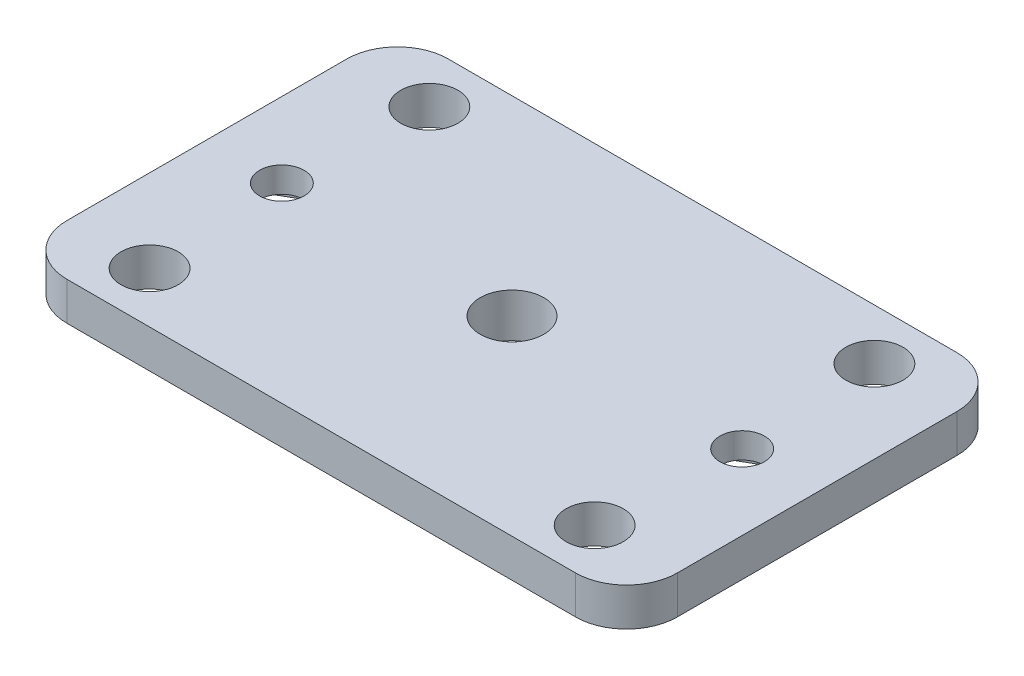
ISO-10303-21;
HEADER;
FILE_DESCRIPTION(('STEP AP214'),'2;1');
FILE_NAME('part.step','',(''),(''),'','','');
FILE_SCHEMA(('AUTOMOTIVE_DESIGN { 1 0 10303 214 1 1 1 1 }'));
ENDSEC;
DATA;
#1=APPLICATION_CONTEXT('core data for automotive mechanical design processes');
#2=APPLICATION_PROTOCOL_DEFINITION('international standard','automotive_design',2000,#1);
#3=PRODUCT_CONTEXT('',#1,'mechanical');
#4=PRODUCT('Part','Part','',(#3));
#5=PRODUCT_RELATED_PRODUCT_CATEGORY('part','',(#4));
#6=PRODUCT_DEFINITION_FORMATION('','',#4);
#7=PRODUCT_DEFINITION_CONTEXT('part definition',#1,'design');
#8=PRODUCT_DEFINITION('design','',#6,#7);
#9=PRODUCT_DEFINITION_SHAPE('','',#8);
#10=(LENGTH_UNIT() NAMED_UNIT(*) SI_UNIT(.MILLI.,.METRE.));
#11=(NAMED_UNIT(*) PLANE_ANGLE_UNIT() SI_UNIT($,.RADIAN.));
#12=(NAMED_UNIT(*) SI_UNIT($,.STERADIAN.) SOLID_ANGLE_UNIT());
#13=UNCERTAINTY_MEASURE_WITH_UNIT(LENGTH_MEASURE(1.E-05),#10,'distance_accuracy_value','');
#14=(GEOMETRIC_REPRESENTATION_CONTEXT(3) GLOBAL_UNCERTAINTY_ASSIGNED_CONTEXT((#13)) GLOBAL_UNIT_ASSIGNED_CONTEXT((#10,
#11,#12)) REPRESENTATION_CONTEXT('',''));
#15=CARTESIAN_POINT('',(0.,0.,0.));
#16=DIRECTION('',(0.,0.,1.));
#17=DIRECTION('',(1.,0.,0.));
#18=AXIS2_PLACEMENT_3D('',#15,#16,#17);
#19=CARTESIAN_POINT('',(0.,-0.45,0.));
#20=DIRECTION('',(0.,1.,0.));
#21=DIRECTION('',(0.,0.,1.));
#22=AXIS2_PLACEMENT_3D('',#19,#20,#21);
#23=CYLINDRICAL_SURFACE('',#22,3.50226733403824);
#24=CARTESIAN_POINT('',(0.,-0.45,0.));
#25=DIRECTION('',(0.,-1.,0.));
#26=DIRECTION('',(0.,0.,-1.));
#27=AXIS2_PLACEMENT_3D('',#24,#25,#26);
#28=CIRCLE('',#27,3.50226733403824);
#29=CARTESIAN_POINT('',(0.,-0.45,-3.50226733403824));
#30=VERTEX_POINT('',#29);
#31=EDGE_CURVE('E390',#30,#30,#28,.T.);
#32=ORIENTED_EDGE('',*,*,#31,.F.);
#33=EDGE_LOOP('',(#32));
#34=FACE_BOUND('',#33,.T.);
#35=CARTESIAN_POINT('',(0.,0.,0.));
#36=DIRECTION('',(0.,1.,0.));
#37=DIRECTION('',(0.,0.,1.));
#38=AXIS2_PLACEMENT_3D('',#35,#36,#37);
#39=CIRCLE('',#38,3.50226733403824);
#40=CARTESIAN_POINT('',(0.,0.,3.50226733403824));
#41=VERTEX_POINT('',#40);
#42=EDGE_CURVE('E370',#41,#41,#39,.T.);
#43=ORIENTED_EDGE('',*,*,#42,.F.);
#44=EDGE_LOOP('',(#43));
#45=FACE_BOUND('',#44,.T.);
#46=ADVANCED_FACE('F38',(#34,#45),#23,.T.);
#47=CARTESIAN_POINT('',(0.,0.55,0.));
#48=DIRECTION('',(0.,1.,0.));
#49=DIRECTION('',(0.,0.,1.));
#50=AXIS2_PLACEMENT_3D('',#47,#48,#49);
#51=PLANE('',#50);
#52=CARTESIAN_POINT('',(0.,0.55,0.));
#53=DIRECTION('',(0.,1.,0.));
#54=DIRECTION('',(0.,0.,1.));
#55=AXIS2_PLACEMENT_3D('',#52,#53,#54);
#56=CIRCLE('',#55,12.085266094354);
#57=CARTESIAN_POINT('',(0.,0.55,12.085266094354));
#58=VERTEX_POINT('',#57);
#59=EDGE_CURVE('E42',#58,#58,#56,.F.);
#60=ORIENTED_EDGE('',*,*,#59,.F.);
#61=EDGE_LOOP('',(#60));
#62=FACE_BOUND('',#61,.T.);
#63=CARTESIAN_POINT('',(0.,0.55,0.));
#64=DIRECTION('',(0.,1.,0.));
#65=DIRECTION('',(0.,0.,1.));
#66=AXIS2_PLACEMENT_3D('',#63,#64,#65);
#67=CIRCLE('',#66,13.75);
#68=CARTESIAN_POINT('',(0.,0.55,13.75));
#69=VERTEX_POINT('',#68);
#70=EDGE_CURVE('E258',#69,#69,#67,.T.);
#71=ORIENTED_EDGE('',*,*,#70,.F.);
#72=EDGE_LOOP('',(#71));
#73=FACE_BOUND('',#72,.T.);
#74=ADVANCED_FACE('F433',(#62,#73),#51,.F.);
#75=CARTESIAN_POINT('',(0.,0.,0.));
#76=DIRECTION('',(0.,1.,0.));
#77=DIRECTION('',(0.,0.,1.));
#78=AXIS2_PLACEMENT_3D('',#75,#76,#77);
#79=PLANE('',#78);
#80=CARTESIAN_POINT('',(0.,0.,0.));
#81=DIRECTION('',(0.,1.,0.));
#82=DIRECTION('',(0.,0.,1.));
#83=AXIS2_PLACEMENT_3D('',#80,#81,#82);
#84=CIRCLE('',#83,13.75);
#85=CARTESIAN_POINT('',(0.,0.,13.75));
#86=VERTEX_POINT('',#85);
#87=EDGE_CURVE('E393',#86,#86,#84,.T.);
#88=ORIENTED_EDGE('',*,*,#87,.T.);
#89=EDGE_LOOP('',(#88));
#90=FACE_BOUND('',#89,.T.);
#91=CARTESIAN_POINT('',(-20.,0.,-11.));
#92=DIRECTION('',(0.,1.,0.));
#93=DIRECTION('',(0.,0.,1.));
#94=AXIS2_PLACEMENT_3D('',#91,#92,#93);
#95=CIRCLE('',#94,4.);
#96=CARTESIAN_POINT('',(-24.,0.,-11.));
#97=VERTEX_POINT('',#96);
#98=CARTESIAN_POINT('',(-20.,0.,-15.));
#99=VERTEX_POINT('',#98);
#100=EDGE_CURVE('E334',#97,#99,#95,.F.);
#101=ORIENTED_EDGE('',*,*,#100,.T.);
#102=DIRECTION('',(1.,0.,0.));
#103=VECTOR('',#102,1.);
#104=CARTESIAN_POINT('',(0.,0.,-15.));
#105=LINE('',#104,#103);
#106=CARTESIAN_POINT('',(20.,0.,-15.));
#107=VERTEX_POINT('',#106);
#108=EDGE_CURVE('E284',#99,#107,#105,.T.);
#109=ORIENTED_EDGE('',*,*,#108,.T.);
#110=CARTESIAN_POINT('',(20.,0.,-11.));
#111=DIRECTION('',(0.,1.,0.));
#112=DIRECTION('',(0.,0.,1.));
#113=AXIS2_PLACEMENT_3D('',#110,#111,#112);
#114=CIRCLE('',#113,4.);
#115=CARTESIAN_POINT('',(24.,0.,-11.));
#116=VERTEX_POINT('',#115);
#117=EDGE_CURVE('E352',#107,#116,#114,.F.);
#118=ORIENTED_EDGE('',*,*,#117,.T.);
#119=DIRECTION('',(0.,0.,-1.));
#120=VECTOR('',#119,1.);
#121=CARTESIAN_POINT('',(24.,0.,0.));
#122=LINE('',#121,#120);
#123=CARTESIAN_POINT('',(24.,0.,11.));
#124=VERTEX_POINT('',#123);
#125=EDGE_CURVE('E349',#124,#116,#122,.T.);
#126=ORIENTED_EDGE('',*,*,#125,.F.);
#127=CARTESIAN_POINT('',(20.,0.,11.));
#128=DIRECTION('',(0.,1.,0.));
#129=DIRECTION('',(0.,0.,1.));
#130=AXIS2_PLACEMENT_3D('',#127,#128,#129);
#131=CIRCLE('',#130,4.);
#132=CARTESIAN_POINT('',(20.,0.,15.));
#133=VERTEX_POINT('',#132);
#134=EDGE_CURVE('E346',#133,#124,#131,.T.);
#135=ORIENTED_EDGE('',*,*,#134,.F.);
#136=DIRECTION('',(1.,0.,0.));
#137=VECTOR('',#136,1.);
#138=CARTESIAN_POINT('',(0.,0.,15.));
#139=LINE('',#138,#137);
#140=CARTESIAN_POINT('',(-20.,0.,15.));
#141=VERTEX_POINT('',#140);
#142=EDGE_CURVE('E343',#141,#133,#139,.T.);
#143=ORIENTED_EDGE('',*,*,#142,.F.);
#144=CARTESIAN_POINT('',(-20.,0.,11.));
#145=DIRECTION('',(0.,1.,0.));
#146=DIRECTION('',(0.,0.,1.));
#147=AXIS2_PLACEMENT_3D('',#144,#145,#146);
#148=CIRCLE('',#147,4.);
#149=CARTESIAN_POINT('',(-24.,0.,11.));
#150=VERTEX_POINT('',#149);
#151=EDGE_CURVE('E340',#141,#150,#148,.F.);
#152=ORIENTED_EDGE('',*,*,#151,.T.);
#153=DIRECTION('',(0.,0.,-1.));
#154=VECTOR('',#153,1.);
#155=CARTESIAN_POINT('',(-24.,0.,0.));
#156=LINE('',#155,#154);
#157=EDGE_CURVE('E337',#150,#97,#156,.T.);
#158=ORIENTED_EDGE('',*,*,#157,.T.);
#159=EDGE_LOOP('',(#101,#109,#118,#126,#135,#143,#152,#158));
#160=FACE_BOUND('',#159,.T.);
#161=CARTESIAN_POINT('',(-17.5,0.,11.));
#162=DIRECTION('',(0.,1.,0.));
#163=DIRECTION('',(0.,0.,1.));
#164=AXIS2_PLACEMENT_3D('',#161,#162,#163);
#165=CIRCLE('',#164,2.25);
#166=CARTESIAN_POINT('',(-17.5,0.,13.25));
#167=VERTEX_POINT('',#166);
#168=EDGE_CURVE('E331',#167,#167,#165,.T.);
#169=ORIENTED_EDGE('',*,*,#168,.T.);
#170=EDGE_LOOP('',(#169));
#171=FACE_BOUND('',#170,.T.);
#172=CARTESIAN_POINT('',(-17.5,0.,-11.));
#173=DIRECTION('',(0.,1.,0.));
#174=DIRECTION('',(0.,0.,1.));
#175=AXIS2_PLACEMENT_3D('',#172,#173,#174);
#176=CIRCLE('',#175,2.25);
#177=CARTESIAN_POINT('',(-17.5,0.,-8.75));
#178=VERTEX_POINT('',#177);
#179=EDGE_CURVE('E328',#178,#178,#176,.T.);
#180=ORIENTED_EDGE('',*,*,#179,.T.);
#181=EDGE_LOOP('',(#180));
#182=FACE_BOUND('',#181,.T.);
#183=CARTESIAN_POINT('',(17.5,0.,11.));
#184=DIRECTION('',(0.,1.,0.));
#185=DIRECTION('',(0.,0.,1.));
#186=AXIS2_PLACEMENT_3D('',#183,#184,#185);
#187=CIRCLE('',#186,2.25);
#188=CARTESIAN_POINT('',(17.5,0.,13.25));
#189=VERTEX_POINT('',#188);
#190=EDGE_CURVE('E204',#189,#189,#187,.T.);
#191=ORIENTED_EDGE('',*,*,#190,.T.);
#192=EDGE_LOOP('',(#191));
#193=FACE_BOUND('',#192,.T.);
#194=CARTESIAN_POINT('',(17.5,0.,-11.));
#195=DIRECTION('',(0.,1.,0.));
#196=DIRECTION('',(0.,0.,1.));
#197=AXIS2_PLACEMENT_3D('',#194,#195,#196);
#198=CIRCLE('',#197,2.25);
#199=CARTESIAN_POINT('',(17.5,0.,-8.75));
#200=VERTEX_POINT('',#199);
#201=EDGE_CURVE('E200',#200,#200,#198,.T.);
#202=ORIENTED_EDGE('',*,*,#201,.T.);
#203=EDGE_LOOP('',(#202));
#204=FACE_BOUND('',#203,.T.);
#205=DIRECTION('',(0.,0.,-1.));
#206=VECTOR('',#205,1.);
#207=CARTESIAN_POINT('',(15.2,0.,0.));
#208=LINE('',#207,#206);
#209=CARTESIAN_POINT('',(15.2,0.,1.67431578064989));
#210=VERTEX_POINT('',#209);
#211=CARTESIAN_POINT('',(15.2,0.,-1.67431578064994));
#212=VERTEX_POINT('',#211);
#213=EDGE_CURVE('E231',#210,#212,#208,.T.);
#214=ORIENTED_EDGE('',*,*,#213,.F.);
#215=DIRECTION('',(-0.866025403784439,0.,-0.5));
#216=VECTOR('',#215,1.);
#217=CARTESIAN_POINT('',(3.07500000000001,0.,-5.32605623327432));
#218=LINE('',#217,#216);
#219=CARTESIAN_POINT('',(18.1,0.,3.34863156129981));
#220=VERTEX_POINT('',#219);
#221=EDGE_CURVE('E63',#220,#210,#218,.T.);
#222=ORIENTED_EDGE('',*,*,#221,.F.);
#223=DIRECTION('',(-0.866025403784438,0.,0.5));
#224=VECTOR('',#223,1.);
#225=CARTESIAN_POINT('',(5.975,0.,10.349003575224));
#226=LINE('',#225,#224);
#227=CARTESIAN_POINT('',(21.,0.,1.67431578064989));
#228=VERTEX_POINT('',#227);
#229=EDGE_CURVE('E243',#228,#220,#226,.T.);
#230=ORIENTED_EDGE('',*,*,#229,.F.);
#231=DIRECTION('',(0.,0.,1.));
#232=VECTOR('',#231,1.);
#233=CARTESIAN_POINT('',(21.,0.,0.));
#234=LINE('',#233,#232);
#235=CARTESIAN_POINT('',(21.,0.,-1.67431578064994));
#236=VERTEX_POINT('',#235);
#237=EDGE_CURVE('E240',#236,#228,#234,.T.);
#238=ORIENTED_EDGE('',*,*,#237,.F.);
#239=DIRECTION('',(0.866025403784439,0.,0.499999999999999));
#240=VECTOR('',#239,1.);
#241=CARTESIAN_POINT('',(5.97499999999999,0.,-10.3490035752241));
#242=LINE('',#241,#240);
#243=CARTESIAN_POINT('',(18.1,0.,-3.34863156129985));
#244=VERTEX_POINT('',#243);
#245=EDGE_CURVE('E237',#244,#236,#242,.T.);
#246=ORIENTED_EDGE('',*,*,#245,.F.);
#247=DIRECTION('',(0.866025403784438,0.,-0.500000000000001));
#248=VECTOR('',#247,1.);
#249=CARTESIAN_POINT('',(3.075,0.,5.32605623327429));
#250=LINE('',#249,#248);
#251=EDGE_CURVE('E234',#212,#244,#250,.T.);
#252=ORIENTED_EDGE('',*,*,#251,.F.);
#253=EDGE_LOOP('',(#214,#222,#230,#238,#246,#252));
#254=FACE_BOUND('',#253,.T.);
#255=DIRECTION('',(0.,0.,1.));
#256=VECTOR('',#255,1.);
#257=CARTESIAN_POINT('',(-21.,0.,0.));
#258=LINE('',#257,#256);
#259=CARTESIAN_POINT('',(-21.,0.,-1.67431578064993));
#260=VERTEX_POINT('',#259);
#261=CARTESIAN_POINT('',(-21.,0.,1.67431578064989));
#262=VERTEX_POINT('',#261);
#263=EDGE_CURVE('E55',#260,#262,#258,.T.);
#264=ORIENTED_EDGE('',*,*,#263,.T.);
#265=DIRECTION('',(0.866025403784439,0.,0.5));
#266=VECTOR('',#265,1.);
#267=CARTESIAN_POINT('',(-5.97499999999999,0.,10.349003575224));
#268=LINE('',#267,#266);
#269=CARTESIAN_POINT('',(-18.1,0.,3.34863156129981));
#270=VERTEX_POINT('',#269);
#271=EDGE_CURVE('E219',#262,#270,#268,.T.);
#272=ORIENTED_EDGE('',*,*,#271,.T.);
#273=DIRECTION('',(0.866025403784439,0.,-0.5));
#274=VECTOR('',#273,1.);
#275=CARTESIAN_POINT('',(-3.075,0.,-5.32605623327431));
#276=LINE('',#275,#274);
#277=CARTESIAN_POINT('',(-15.2,0.,1.6743157806499));
#278=VERTEX_POINT('',#277);
#279=EDGE_CURVE('E222',#270,#278,#276,.T.);
#280=ORIENTED_EDGE('',*,*,#279,.T.);
#281=DIRECTION('',(0.,0.,-1.));
#282=VECTOR('',#281,1.);
#283=CARTESIAN_POINT('',(-15.2,0.,0.));
#284=LINE('',#283,#282);
#285=CARTESIAN_POINT('',(-15.2,0.,-1.67431578064993));
#286=VERTEX_POINT('',#285);
#287=EDGE_CURVE('E225',#278,#286,#284,.T.);
#288=ORIENTED_EDGE('',*,*,#287,.T.);
#289=DIRECTION('',(-0.866025403784439,0.,-0.5));
#290=VECTOR('',#289,1.);
#291=CARTESIAN_POINT('',(-3.075,0.,5.32605623327429));
#292=LINE('',#291,#290);
#293=CARTESIAN_POINT('',(-18.1,0.,-3.34863156129985));
#294=VERTEX_POINT('',#293);
#295=EDGE_CURVE('E226',#286,#294,#292,.T.);
#296=ORIENTED_EDGE('',*,*,#295,.T.);
#297=DIRECTION('',(-0.866025403784439,0.,0.5));
#298=VECTOR('',#297,1.);
#299=CARTESIAN_POINT('',(-5.975,0.,-10.3490035752241));
#300=LINE('',#299,#298);
#301=EDGE_CURVE('E182',#294,#260,#300,.T.);
#302=ORIENTED_EDGE('',*,*,#301,.T.);
#303=EDGE_LOOP('',(#264,#272,#280,#288,#296,#302));
#304=FACE_BOUND('',#303,.T.);
#305=ADVANCED_FACE('F406',(#90,#160,#171,#182,#193,#204,#254,#304),#79,.F.);
#306=CARTESIAN_POINT('',(-20.,3.,-11.));
#307=DIRECTION('',(0.,-1.,0.));
#308=DIRECTION('',(0.,0.,-1.));
#309=AXIS2_PLACEMENT_3D('',#306,#307,#308);
#310=CYLINDRICAL_SURFACE('',#309,4.);
#311=ORIENTED_EDGE('',*,*,#100,.F.);
#312=DIRECTION('',(0.,-1.,0.));
#313=VECTOR('',#312,1.);
#314=CARTESIAN_POINT('',(-24.,3.,-11.));
#315=LINE('',#314,#313);
#316=CARTESIAN_POINT('',(-24.,3.,-11.));
#317=VERTEX_POINT('',#316);
#318=EDGE_CURVE('E12',#317,#97,#315,.T.);
#319=ORIENTED_EDGE('',*,*,#318,.F.);
#320=CARTESIAN_POINT('',(-20.,3.,-11.));
#321=DIRECTION('',(0.,1.,0.));
#322=DIRECTION('',(0.,0.,1.));
#323=AXIS2_PLACEMENT_3D('',#320,#321,#322);
#324=CIRCLE('',#323,4.);
#325=CARTESIAN_POINT('',(-20.,3.,-15.));
#326=VERTEX_POINT('',#325);
#327=EDGE_CURVE('E293',#317,#326,#324,.F.);
#328=ORIENTED_EDGE('',*,*,#327,.T.);
#329=DIRECTION('',(0.,-1.,0.));
#330=VECTOR('',#329,1.);
#331=CARTESIAN_POINT('',(-20.,3.,-15.));
#332=LINE('',#331,#330);
#333=EDGE_CURVE('E324',#326,#99,#332,.T.);
#334=ORIENTED_EDGE('',*,*,#333,.T.);
#335=EDGE_LOOP('',(#311,#319,#328,#334));
#336=FACE_BOUND('',#335,.T.);
#337=ADVANCED_FACE('F640',(#336),#310,.T.);
#338=CARTESIAN_POINT('',(-24.,3.,0.));
#339=DIRECTION('',(-1.,0.,0.));
#340=DIRECTION('',(0.,0.,1.));
#341=AXIS2_PLACEMENT_3D('',#338,#339,#340);
#342=PLANE('',#341);
#343=ORIENTED_EDGE('',*,*,#157,.F.);
#344=DIRECTION('',(0.,-1.,0.));
#345=VECTOR('',#344,1.);
#346=CARTESIAN_POINT('',(-24.,3.,11.));
#347=LINE('',#346,#345);
#348=CARTESIAN_POINT('',(-24.,3.,11.));
#349=VERTEX_POINT('',#348);
#350=EDGE_CURVE('E47',#349,#150,#347,.T.);
#351=ORIENTED_EDGE('',*,*,#350,.F.);
#352=DIRECTION('',(0.,0.,-1.));
#353=VECTOR('',#352,1.);
#354=CARTESIAN_POINT('',(-24.,3.,0.));
#355=LINE('',#354,#353);
#356=EDGE_CURVE('E296',#349,#317,#355,.T.);
#357=ORIENTED_EDGE('',*,*,#356,.T.);
#358=ORIENTED_EDGE('',*,*,#318,.T.);
#359=EDGE_LOOP('',(#343,#351,#357,#358));
#360=FACE_BOUND('',#359,.T.);
#361=ADVANCED_FACE('F653',(#360),#342,.T.);
#362=CARTESIAN_POINT('',(-20.,3.,11.));
#363=DIRECTION('',(0.,-1.,0.));
#364=DIRECTION('',(0.,0.,-1.));
#365=AXIS2_PLACEMENT_3D('',#362,#363,#364);
#366=CYLINDRICAL_SURFACE('',#365,4.);
#367=ORIENTED_EDGE('',*,*,#151,.F.);
#368=DIRECTION('',(0.,-1.,0.));
#369=VECTOR('',#368,1.);
#370=CARTESIAN_POINT('',(-20.,3.,15.));
#371=LINE('',#370,#369);
#372=CARTESIAN_POINT('',(-20.,3.,15.));
#373=VERTEX_POINT('',#372);
#374=EDGE_CURVE('E368',#373,#141,#371,.T.);
#375=ORIENTED_EDGE('',*,*,#374,.F.);
#376=CARTESIAN_POINT('',(-20.,3.,11.));
#377=DIRECTION('',(0.,1.,0.));
#378=DIRECTION('',(0.,0.,1.));
#379=AXIS2_PLACEMENT_3D('',#376,#377,#378);
#380=CIRCLE('',#379,4.);
#381=EDGE_CURVE('E299',#373,#349,#380,.F.);
#382=ORIENTED_EDGE('',*,*,#381,.T.);
#383=ORIENTED_EDGE('',*,*,#350,.T.);
#384=EDGE_LOOP('',(#367,#375,#382,#383));
#385=FACE_BOUND('',#384,.T.);
#386=ADVANCED_FACE('F661',(#385),#366,.T.);
#387=CARTESIAN_POINT('',(0.,3.,15.));
#388=DIRECTION('',(0.,0.,-1.));
#389=DIRECTION('',(-1.,0.,0.));
#390=AXIS2_PLACEMENT_3D('',#387,#388,#389);
#391=PLANE('',#390);
#392=ORIENTED_EDGE('',*,*,#142,.T.);
#393=DIRECTION('',(0.,-1.,0.));
#394=VECTOR('',#393,1.);
#395=CARTESIAN_POINT('',(20.,3.,15.));
#396=LINE('',#395,#394);
#397=CARTESIAN_POINT('',(20.,3.,15.));
#398=VERTEX_POINT('',#397);
#399=EDGE_CURVE('E365',#398,#133,#396,.T.);
#400=ORIENTED_EDGE('',*,*,#399,.F.);
#401=DIRECTION('',(1.,0.,0.));
#402=VECTOR('',#401,1.);
#403=CARTESIAN_POINT('',(0.,3.,15.));
#404=LINE('',#403,#402);
#405=EDGE_CURVE('E302',#373,#398,#404,.T.);
#406=ORIENTED_EDGE('',*,*,#405,.F.);
#407=ORIENTED_EDGE('',*,*,#374,.T.);
#408=EDGE_LOOP('',(#392,#400,#406,#407));
#409=FACE_BOUND('',#408,.T.);
#410=ADVANCED_FACE('F669',(#409),#391,.F.);
#411=CARTESIAN_POINT('',(20.,3.,11.));
#412=DIRECTION('',(0.,-1.,0.));
#413=DIRECTION('',(0.,0.,-1.));
#414=AXIS2_PLACEMENT_3D('',#411,#412,#413);
#415=CYLINDRICAL_SURFACE('',#414,4.);
#416=ORIENTED_EDGE('',*,*,#134,.T.);
#417=DIRECTION('',(0.,-1.,0.));
#418=VECTOR('',#417,1.);
#419=CARTESIAN_POINT('',(24.,3.,11.));
#420=LINE('',#419,#418);
#421=CARTESIAN_POINT('',(24.,3.,11.));
#422=VERTEX_POINT('',#421);
#423=EDGE_CURVE('E362',#422,#124,#420,.T.);
#424=ORIENTED_EDGE('',*,*,#423,.F.);
#425=CARTESIAN_POINT('',(20.,3.,11.));
#426=DIRECTION('',(0.,1.,0.));
#427=DIRECTION('',(0.,0.,1.));
#428=AXIS2_PLACEMENT_3D('',#425,#426,#427);
#429=CIRCLE('',#428,4.);
#430=EDGE_CURVE('E305',#398,#422,#429,.T.);
#431=ORIENTED_EDGE('',*,*,#430,.F.);
#432=ORIENTED_EDGE('',*,*,#399,.T.);
#433=EDGE_LOOP('',(#416,#424,#431,#432));
#434=FACE_BOUND('',#433,.T.);
#435=ADVANCED_FACE('F677',(#434),#415,.T.);
#436=CARTESIAN_POINT('',(24.,3.,0.));
#437=DIRECTION('',(-1.,0.,0.));
#438=DIRECTION('',(0.,0.,1.));
#439=AXIS2_PLACEMENT_3D('',#436,#437,#438);
#440=PLANE('',#439);
#441=ORIENTED_EDGE('',*,*,#125,.T.);
#442=DIRECTION('',(0.,-1.,0.));
#443=VECTOR('',#442,1.);
#444=CARTESIAN_POINT('',(24.,3.,-11.));
#445=LINE('',#444,#443);
#446=CARTESIAN_POINT('',(24.,3.,-11.));
#447=VERTEX_POINT('',#446);
#448=EDGE_CURVE('E360',#447,#116,#445,.T.);
#449=ORIENTED_EDGE('',*,*,#448,.F.);
#450=DIRECTION('',(0.,0.,-1.));
#451=VECTOR('',#450,1.);
#452=CARTESIAN_POINT('',(24.,3.,0.));
#453=LINE('',#452,#451);
#454=EDGE_CURVE('E308',#422,#447,#453,.T.);
#455=ORIENTED_EDGE('',*,*,#454,.F.);
#456=ORIENTED_EDGE('',*,*,#423,.T.);
#457=EDGE_LOOP('',(#441,#449,#455,#456));
#458=FACE_BOUND('',#457,.T.);
#459=ADVANCED_FACE('F685',(#458),#440,.F.);
#460=CARTESIAN_POINT('',(20.,3.,-11.));
#461=DIRECTION('',(0.,-1.,0.));
#462=DIRECTION('',(0.,0.,-1.));
#463=AXIS2_PLACEMENT_3D('',#460,#461,#462);
#464=CYLINDRICAL_SURFACE('',#463,4.);
#465=ORIENTED_EDGE('',*,*,#117,.F.);
#466=DIRECTION('',(0.,-1.,0.));
#467=VECTOR('',#466,1.);
#468=CARTESIAN_POINT('',(20.,3.,-15.));
#469=LINE('',#468,#467);
#470=CARTESIAN_POINT('',(20.,3.,-15.));
#471=VERTEX_POINT('',#470);
#472=EDGE_CURVE('E358',#471,#107,#469,.T.);
#473=ORIENTED_EDGE('',*,*,#472,.F.);
#474=CARTESIAN_POINT('',(20.,3.,-11.));
#475=DIRECTION('',(0.,1.,0.));
#476=DIRECTION('',(0.,0.,1.));
#477=AXIS2_PLACEMENT_3D('',#474,#475,#476);
#478=CIRCLE('',#477,4.);
#479=EDGE_CURVE('E310',#471,#447,#478,.F.);
#480=ORIENTED_EDGE('',*,*,#479,.T.);
#481=ORIENTED_EDGE('',*,*,#448,.T.);
#482=EDGE_LOOP('',(#465,#473,#480,#481));
#483=FACE_BOUND('',#482,.T.);
#484=ADVANCED_FACE('F693',(#483),#464,.T.);
#485=CARTESIAN_POINT('',(-18.1,3.,0.));
#486=DIRECTION('',(0.,-1.,0.));
#487=DIRECTION('',(0.,0.,-1.));
#488=AXIS2_PLACEMENT_3D('',#485,#486,#487);
#489=CYLINDRICAL_SURFACE('',#488,1.75);
#490=CARTESIAN_POINT('',(-18.1,0.999999999999999,0.));
#491=DIRECTION('',(0.,1.,0.));
#492=DIRECTION('',(0.,0.,1.));
#493=AXIS2_PLACEMENT_3D('',#490,#491,#492);
#494=CIRCLE('',#493,1.75);
#495=CARTESIAN_POINT('',(-18.1,0.999999999999999,1.75));
#496=VERTEX_POINT('',#495);
#497=EDGE_CURVE('E187',#496,#496,#494,.T.);
#498=ORIENTED_EDGE('',*,*,#497,.F.);
#499=EDGE_LOOP('',(#498));
#500=FACE_BOUND('',#499,.T.);
#501=CARTESIAN_POINT('',(-18.1,3.,0.));
#502=DIRECTION('',(0.,1.,0.));
#503=DIRECTION('',(0.,0.,1.));
#504=AXIS2_PLACEMENT_3D('',#501,#502,#503);
#505=CIRCLE('',#504,1.75);
#506=CARTESIAN_POINT('',(-18.1,3.,1.75));
#507=VERTEX_POINT('',#506);
#508=EDGE_CURVE('E319',#507,#507,#505,.T.);
#509=ORIENTED_EDGE('',*,*,#508,.T.);
#510=EDGE_LOOP('',(#509));
#511=FACE_BOUND('',#510,.T.);
#512=ADVANCED_FACE('F701',(#500,#511),#489,.F.);
#513=CARTESIAN_POINT('',(18.1,3.,0.));
#514=DIRECTION('',(0.,-1.,0.));
#515=DIRECTION('',(0.,0.,-1.));
#516=AXIS2_PLACEMENT_3D('',#513,#514,#515);
#517=CYLINDRICAL_SURFACE('',#516,1.75);
#518=CARTESIAN_POINT('',(18.1,0.999999999999999,0.));
#519=DIRECTION('',(0.,1.,0.));
#520=DIRECTION('',(0.,0.,1.));
#521=AXIS2_PLACEMENT_3D('',#518,#519,#520);
#522=CIRCLE('',#521,1.75);
#523=CARTESIAN_POINT('',(18.1,0.999999999999999,1.74999999999997));
#524=VERTEX_POINT('',#523);
#525=EDGE_CURVE('E230',#524,#524,#522,.F.);
#526=ORIENTED_EDGE('',*,*,#525,.T.);
#527=EDGE_LOOP('',(#526));
#528=FACE_BOUND('',#527,.T.);
#529=CARTESIAN_POINT('',(18.1,3.,0.));
#530=DIRECTION('',(0.,1.,0.));
#531=DIRECTION('',(0.,0.,1.));
#532=AXIS2_PLACEMENT_3D('',#529,#530,#531);
#533=CIRCLE('',#532,1.75);
#534=CARTESIAN_POINT('',(18.1,3.,1.74999999999997));
#535=VERTEX_POINT('',#534);
#536=EDGE_CURVE('E316',#535,#535,#533,.F.);
#537=ORIENTED_EDGE('',*,*,#536,.F.);
#538=EDGE_LOOP('',(#537));
#539=FACE_BOUND('',#538,.T.);
#540=ADVANCED_FACE('F710',(#528,#539),#517,.F.);
#541=CARTESIAN_POINT('',(0.,3.,-15.));
#542=DIRECTION('',(0.,0.,-1.));
#543=DIRECTION('',(-1.,0.,0.));
#544=AXIS2_PLACEMENT_3D('',#541,#542,#543);
#545=PLANE('',#544);
#546=ORIENTED_EDGE('',*,*,#108,.F.);
#547=ORIENTED_EDGE('',*,*,#333,.F.);
#548=DIRECTION('',(1.,0.,0.));
#549=VECTOR('',#548,1.);
#550=CARTESIAN_POINT('',(0.,3.,-15.));
#551=LINE('',#550,#549);
#552=EDGE_CURVE('E313',#326,#471,#551,.T.);
#553=ORIENTED_EDGE('',*,*,#552,.T.);
#554=ORIENTED_EDGE('',*,*,#472,.T.);
#555=EDGE_LOOP('',(#546,#547,#553,#554));
#556=FACE_BOUND('',#555,.T.);
#557=ADVANCED_FACE('F718',(#556),#545,.T.);
#558=CARTESIAN_POINT('',(-17.5,3.,11.));
#559=DIRECTION('',(0.,-1.,0.));
#560=DIRECTION('',(0.,0.,-1.));
#561=AXIS2_PLACEMENT_3D('',#558,#559,#560);
#562=CYLINDRICAL_SURFACE('',#561,2.25);
#563=CARTESIAN_POINT('',(-17.5,3.,11.));
#564=DIRECTION('',(0.,1.,0.));
#565=DIRECTION('',(0.,0.,1.));
#566=AXIS2_PLACEMENT_3D('',#563,#564,#565);
#567=CIRCLE('',#566,2.25);
#568=CARTESIAN_POINT('',(-17.5,3.,13.25));
#569=VERTEX_POINT('',#568);
#570=EDGE_CURVE('E290',#569,#569,#567,.T.);
#571=ORIENTED_EDGE('',*,*,#570,.T.);
#572=EDGE_LOOP('',(#571));
#573=FACE_BOUND('',#572,.T.);
#574=ORIENTED_EDGE('',*,*,#168,.F.);
#575=EDGE_LOOP('',(#574));
#576=FACE_BOUND('',#575,.T.);
#577=ADVANCED_FACE('F725',(#573,#576),#562,.F.);
#578=CARTESIAN_POINT('',(-17.5,3.,-11.));
#579=DIRECTION('',(0.,-1.,0.));
#580=DIRECTION('',(0.,0.,-1.));
#581=AXIS2_PLACEMENT_3D('',#578,#579,#580);
#582=CYLINDRICAL_SURFACE('',#581,2.25);
#583=CARTESIAN_POINT('',(-17.5,3.,-11.));
#584=DIRECTION('',(0.,1.,0.));
#585=DIRECTION('',(0.,0.,1.));
#586=AXIS2_PLACEMENT_3D('',#583,#584,#585);
#587=CIRCLE('',#586,2.25);
#588=CARTESIAN_POINT('',(-17.5,3.,-8.75));
#589=VERTEX_POINT('',#588);
#590=EDGE_CURVE('E287',#589,#589,#587,.T.);
#591=ORIENTED_EDGE('',*,*,#590,.T.);
#592=EDGE_LOOP('',(#591));
#593=FACE_BOUND('',#592,.T.);
#594=ORIENTED_EDGE('',*,*,#179,.F.);
#595=EDGE_LOOP('',(#594));
#596=FACE_BOUND('',#595,.T.);
#597=ADVANCED_FACE('F733',(#593,#596),#582,.F.);
#598=CARTESIAN_POINT('',(17.5,3.,11.));
#599=DIRECTION('',(0.,-1.,0.));
#600=DIRECTION('',(0.,0.,-1.));
#601=AXIS2_PLACEMENT_3D('',#598,#599,#600);
#602=CYLINDRICAL_SURFACE('',#601,2.25);
#603=CARTESIAN_POINT('',(17.5,3.,11.));
#604=DIRECTION('',(0.,1.,0.));
#605=DIRECTION('',(0.,0.,1.));
#606=AXIS2_PLACEMENT_3D('',#603,#604,#605);
#607=CIRCLE('',#606,2.25);
#608=CARTESIAN_POINT('',(17.5,3.,13.25));
#609=VERTEX_POINT('',#608);
#610=EDGE_CURVE('E283',#609,#609,#607,.T.);
#611=ORIENTED_EDGE('',*,*,#610,.T.);
#612=EDGE_LOOP('',(#611));
#613=FACE_BOUND('',#612,.T.);
#614=ORIENTED_EDGE('',*,*,#190,.F.);
#615=EDGE_LOOP('',(#614));
#616=FACE_BOUND('',#615,.T.);
#617=ADVANCED_FACE('F741',(#613,#616),#602,.F.);
#618=CARTESIAN_POINT('',(17.5,3.,-11.));
#619=DIRECTION('',(0.,-1.,0.));
#620=DIRECTION('',(0.,0.,-1.));
#621=AXIS2_PLACEMENT_3D('',#618,#619,#620);
#622=CYLINDRICAL_SURFACE('',#621,2.25);
#623=CARTESIAN_POINT('',(17.5,3.,-11.));
#624=DIRECTION('',(0.,1.,0.));
#625=DIRECTION('',(0.,0.,1.));
#626=AXIS2_PLACEMENT_3D('',#623,#624,#625);
#627=CIRCLE('',#626,2.25);
#628=CARTESIAN_POINT('',(17.5,3.,-8.75));
#629=VERTEX_POINT('',#628);
#630=EDGE_CURVE('E280',#629,#629,#627,.T.);
#631=ORIENTED_EDGE('',*,*,#630,.T.);
#632=EDGE_LOOP('',(#631));
#633=FACE_BOUND('',#632,.T.);
#634=ORIENTED_EDGE('',*,*,#201,.F.);
#635=EDGE_LOOP('',(#634));
#636=FACE_BOUND('',#635,.T.);
#637=ADVANCED_FACE('F40',(#633,#636),#622,.F.);
#638=CARTESIAN_POINT('',(0.,3.,0.));
#639=DIRECTION('',(0.,-1.,0.));
#640=DIRECTION('',(0.,0.,-1.));
#641=AXIS2_PLACEMENT_3D('',#638,#639,#640);
#642=CYLINDRICAL_SURFACE('',#641,2.50226733403824);
#643=CARTESIAN_POINT('',(0.,3.,0.));
#644=DIRECTION('',(0.,1.,0.));
#645=DIRECTION('',(0.,0.,1.));
#646=AXIS2_PLACEMENT_3D('',#643,#644,#645);
#647=CIRCLE('',#646,2.50226733403824);
#648=CARTESIAN_POINT('',(0.,3.,2.50226733403824));
#649=VERTEX_POINT('',#648);
#650=EDGE_CURVE('E322',#649,#649,#647,.T.);
#651=ORIENTED_EDGE('',*,*,#650,.T.);
#652=EDGE_LOOP('',(#651));
#653=FACE_BOUND('',#652,.T.);
#654=CARTESIAN_POINT('',(0.,-0.45,0.));
#655=DIRECTION('',(0.,-1.,0.));
#656=DIRECTION('',(0.,0.,-1.));
#657=AXIS2_PLACEMENT_3D('',#654,#655,#656);
#658=CIRCLE('',#657,2.50226733403824);
#659=CARTESIAN_POINT('',(0.,-0.45,-2.50226733403824));
#660=VERTEX_POINT('',#659);
#661=EDGE_CURVE('E376',#660,#660,#658,.T.);
#662=ORIENTED_EDGE('',*,*,#661,.T.);
#663=EDGE_LOOP('',(#662));
#664=FACE_BOUND('',#663,.T.);
#665=ADVANCED_FACE('F540',(#653,#664),#642,.F.);
#666=CARTESIAN_POINT('',(0.,3.,0.));
#667=DIRECTION('',(0.,1.,0.));
#668=DIRECTION('',(0.,0.,1.));
#669=AXIS2_PLACEMENT_3D('',#666,#667,#668);
#670=PLANE('',#669);
#671=ORIENTED_EDGE('',*,*,#630,.F.);
#672=EDGE_LOOP('',(#671));
#673=FACE_BOUND('',#672,.T.);
#674=ORIENTED_EDGE('',*,*,#610,.F.);
#675=EDGE_LOOP('',(#674));
#676=FACE_BOUND('',#675,.T.);
#677=ORIENTED_EDGE('',*,*,#590,.F.);
#678=EDGE_LOOP('',(#677));
#679=FACE_BOUND('',#678,.T.);
#680=ORIENTED_EDGE('',*,*,#570,.F.);
#681=EDGE_LOOP('',(#680));
#682=FACE_BOUND('',#681,.T.);
#683=ORIENTED_EDGE('',*,*,#327,.F.);
#684=ORIENTED_EDGE('',*,*,#356,.F.);
#685=ORIENTED_EDGE('',*,*,#381,.F.);
#686=ORIENTED_EDGE('',*,*,#405,.T.);
#687=ORIENTED_EDGE('',*,*,#430,.T.);
#688=ORIENTED_EDGE('',*,*,#454,.T.);
#689=ORIENTED_EDGE('',*,*,#479,.F.);
#690=ORIENTED_EDGE('',*,*,#552,.F.);
#691=EDGE_LOOP('',(#683,#684,#685,#686,#687,#688,#689,#690));
#692=FACE_BOUND('',#691,.T.);
#693=ORIENTED_EDGE('',*,*,#536,.T.);
#694=EDGE_LOOP('',(#693));
#695=FACE_BOUND('',#694,.T.);
#696=ORIENTED_EDGE('',*,*,#508,.F.);
#697=EDGE_LOOP('',(#696));
#698=FACE_BOUND('',#697,.T.);
#699=ORIENTED_EDGE('',*,*,#650,.F.);
#700=EDGE_LOOP('',(#699));
#701=FACE_BOUND('',#700,.T.);
#702=ADVANCED_FACE('F546',(#673,#676,#679,#682,#692,#695,#698,#701),#670,.T.);
#703=CARTESIAN_POINT('',(3.07500000000001,11.8596463435813,-5.32605623327432));
#704=DIRECTION('',(-0.5,0.,0.866025403784439));
#705=DIRECTION('',(0.866025403784439,0.,0.5));
#706=AXIS2_PLACEMENT_3D('',#703,#704,#705);
#707=PLANE('',#706);
#708=DIRECTION('',(0.,-1.,0.));
#709=VECTOR('',#708,1.);
#710=CARTESIAN_POINT('',(18.1,11.8596463435813,3.34863156129981));
#711=LINE('',#710,#709);
#712=CARTESIAN_POINT('',(18.1,0.999999999999999,3.34863156129981));
#713=VERTEX_POINT('',#712);
#714=EDGE_CURVE('E262',#713,#220,#711,.T.);
#715=ORIENTED_EDGE('',*,*,#714,.T.);
#716=ORIENTED_EDGE('',*,*,#221,.T.);
#717=DIRECTION('',(0.,-1.,0.));
#718=VECTOR('',#717,1.);
#719=CARTESIAN_POINT('',(15.2,11.8596463435813,1.67431578064989));
#720=LINE('',#719,#718);
#721=CARTESIAN_POINT('',(15.2,0.999999999999999,1.67431578064989));
#722=VERTEX_POINT('',#721);
#723=EDGE_CURVE('E257',#722,#210,#720,.T.);
#724=ORIENTED_EDGE('',*,*,#723,.F.);
#725=DIRECTION('',(-0.866025403784439,0.,-0.5));
#726=VECTOR('',#725,1.);
#727=CARTESIAN_POINT('',(3.07500000000001,0.999999999999999,-5.32605623327432));
#728=LINE('',#727,#726);
#729=EDGE_CURVE('E254',#713,#722,#728,.T.);
#730=ORIENTED_EDGE('',*,*,#729,.F.);
#731=EDGE_LOOP('',(#715,#716,#724,#730));
#732=FACE_BOUND('',#731,.T.);
#733=ADVANCED_FACE('F624',(#732),#707,.F.);
#734=CARTESIAN_POINT('',(5.975,11.8596463435813,10.349003575224));
#735=DIRECTION('',(0.5,0.,0.866025403784438));
#736=DIRECTION('',(0.866025403784438,0.,-0.5));
#737=AXIS2_PLACEMENT_3D('',#734,#735,#736);
#738=PLANE('',#737);
#739=DIRECTION('',(0.,-1.,0.));
#740=VECTOR('',#739,1.);
#741=CARTESIAN_POINT('',(21.,11.8596463435813,1.67431578064989));
#742=LINE('',#741,#740);
#743=CARTESIAN_POINT('',(21.,0.999999999999999,1.67431578064989));
#744=VERTEX_POINT('',#743);
#745=EDGE_CURVE('E266',#744,#228,#742,.T.);
#746=ORIENTED_EDGE('',*,*,#745,.T.);
#747=ORIENTED_EDGE('',*,*,#229,.T.);
#748=ORIENTED_EDGE('',*,*,#714,.F.);
#749=DIRECTION('',(-0.866025403784438,0.,0.5));
#750=VECTOR('',#749,1.);
#751=CARTESIAN_POINT('',(5.975,0.999999999999999,10.349003575224));
#752=LINE('',#751,#750);
#753=EDGE_CURVE('E259',#744,#713,#752,.T.);
#754=ORIENTED_EDGE('',*,*,#753,.F.);
#755=EDGE_LOOP('',(#746,#747,#748,#754));
#756=FACE_BOUND('',#755,.T.);
#757=ADVANCED_FACE('F615',(#756),#738,.F.);
#758=CARTESIAN_POINT('',(21.,11.8596463435813,0.));
#759=DIRECTION('',(1.,0.,0.));
#760=DIRECTION('',(0.,0.,-1.));
#761=AXIS2_PLACEMENT_3D('',#758,#759,#760);
#762=PLANE('',#761);
#763=DIRECTION('',(0.,-1.,0.));
#764=VECTOR('',#763,1.);
#765=CARTESIAN_POINT('',(21.,11.8596463435813,-1.67431578064994));
#766=LINE('',#765,#764);
#767=CARTESIAN_POINT('',(21.,0.999999999999999,-1.67431578064994));
#768=VERTEX_POINT('',#767);
#769=EDGE_CURVE('E270',#768,#236,#766,.T.);
#770=ORIENTED_EDGE('',*,*,#769,.T.);
#771=ORIENTED_EDGE('',*,*,#237,.T.);
#772=ORIENTED_EDGE('',*,*,#745,.F.);
#773=DIRECTION('',(0.,0.,1.));
#774=VECTOR('',#773,1.);
#775=CARTESIAN_POINT('',(21.,0.999999999999999,0.));
#776=LINE('',#775,#774);
#777=EDGE_CURVE('E263',#768,#744,#776,.T.);
#778=ORIENTED_EDGE('',*,*,#777,.F.);
#779=EDGE_LOOP('',(#770,#771,#772,#778));
#780=FACE_BOUND('',#779,.T.);
#781=ADVANCED_FACE('F606',(#780),#762,.F.);
#782=CARTESIAN_POINT('',(5.97499999999999,11.8596463435813,-10.3490035752241));
#783=DIRECTION('',(0.499999999999999,0.,-0.866025403784439));
#784=DIRECTION('',(-0.866025403784439,0.,-0.499999999999999));
#785=AXIS2_PLACEMENT_3D('',#782,#783,#784);
#786=PLANE('',#785);
#787=DIRECTION('',(0.,-1.,0.));
#788=VECTOR('',#787,1.);
#789=CARTESIAN_POINT('',(18.1,11.8596463435813,-3.34863156129985));
#790=LINE('',#789,#788);
#791=CARTESIAN_POINT('',(18.1,0.999999999999999,-3.34863156129985));
#792=VERTEX_POINT('',#791);
#793=EDGE_CURVE('E253',#792,#244,#790,.T.);
#794=ORIENTED_EDGE('',*,*,#793,.T.);
#795=ORIENTED_EDGE('',*,*,#245,.T.);
#796=ORIENTED_EDGE('',*,*,#769,.F.);
#797=DIRECTION('',(0.866025403784439,0.,0.499999999999999));
#798=VECTOR('',#797,1.);
#799=CARTESIAN_POINT('',(5.97499999999999,0.999999999999999,-10.3490035752241));
#800=LINE('',#799,#798);
#801=EDGE_CURVE('E267',#792,#768,#800,.T.);
#802=ORIENTED_EDGE('',*,*,#801,.F.);
#803=EDGE_LOOP('',(#794,#795,#796,#802));
#804=FACE_BOUND('',#803,.T.);
#805=ADVANCED_FACE('F597',(#804),#786,.F.);
#806=CARTESIAN_POINT('',(3.075,11.8596463435813,5.32605623327429));
#807=DIRECTION('',(-0.500000000000001,0.,-0.866025403784438));
#808=DIRECTION('',(-0.866025403784438,0.,0.500000000000001));
#809=AXIS2_PLACEMENT_3D('',#806,#807,#808);
#810=PLANE('',#809);
#811=DIRECTION('',(0.,-1.,0.));
#812=VECTOR('',#811,1.);
#813=CARTESIAN_POINT('',(15.2,11.8596463435813,-1.67431578064994));
#814=LINE('',#813,#812);
#815=CARTESIAN_POINT('',(15.2,0.999999999999999,-1.67431578064994));
#816=VERTEX_POINT('',#815);
#817=EDGE_CURVE('E247',#816,#212,#814,.T.);
#818=ORIENTED_EDGE('',*,*,#817,.T.);
#819=ORIENTED_EDGE('',*,*,#251,.T.);
#820=ORIENTED_EDGE('',*,*,#793,.F.);
#821=DIRECTION('',(0.866025403784438,0.,-0.500000000000001));
#822=VECTOR('',#821,1.);
#823=CARTESIAN_POINT('',(3.075,0.999999999999999,5.32605623327429));
#824=LINE('',#823,#822);
#825=EDGE_CURVE('E271',#816,#792,#824,.T.);
#826=ORIENTED_EDGE('',*,*,#825,.F.);
#827=EDGE_LOOP('',(#818,#819,#820,#826));
#828=FACE_BOUND('',#827,.T.);
#829=ADVANCED_FACE('F588',(#828),#810,.F.);
#830=CARTESIAN_POINT('',(15.2,11.8596463435813,0.));
#831=DIRECTION('',(-1.,0.,0.));
#832=DIRECTION('',(0.,0.,1.));
#833=AXIS2_PLACEMENT_3D('',#830,#831,#832);
#834=PLANE('',#833);
#835=ORIENTED_EDGE('',*,*,#723,.T.);
#836=ORIENTED_EDGE('',*,*,#213,.T.);
#837=ORIENTED_EDGE('',*,*,#817,.F.);
#838=DIRECTION('',(0.,0.,-1.));
#839=VECTOR('',#838,1.);
#840=CARTESIAN_POINT('',(15.2,0.999999999999999,0.));
#841=LINE('',#840,#839);
#842=EDGE_CURVE('E250',#722,#816,#841,.T.);
#843=ORIENTED_EDGE('',*,*,#842,.F.);
#844=EDGE_LOOP('',(#835,#836,#837,#843));
#845=FACE_BOUND('',#844,.T.);
#846=ADVANCED_FACE('F428',(#845),#834,.F.);
#847=CARTESIAN_POINT('',(0.,1.,0.));
#848=DIRECTION('',(0.,1.,0.));
#849=DIRECTION('',(0.,0.,1.));
#850=AXIS2_PLACEMENT_3D('',#847,#848,#849);
#851=PLANE('',#850);
#852=ORIENTED_EDGE('',*,*,#729,.T.);
#853=ORIENTED_EDGE('',*,*,#842,.T.);
#854=ORIENTED_EDGE('',*,*,#825,.T.);
#855=ORIENTED_EDGE('',*,*,#801,.T.);
#856=ORIENTED_EDGE('',*,*,#777,.T.);
#857=ORIENTED_EDGE('',*,*,#753,.T.);
#858=EDGE_LOOP('',(#852,#853,#854,#855,#856,#857));
#859=FACE_BOUND('',#858,.T.);
#860=ORIENTED_EDGE('',*,*,#525,.F.);
#861=EDGE_LOOP('',(#860));
#862=FACE_BOUND('',#861,.T.);
#863=ADVANCED_FACE('F421',(#859,#862),#851,.F.);
#864=CARTESIAN_POINT('',(-21.,11.8596463435813,0.));
#865=DIRECTION('',(1.,0.,0.));
#866=DIRECTION('',(0.,0.,-1.));
#867=AXIS2_PLACEMENT_3D('',#864,#865,#866);
#868=PLANE('',#867);
#869=DIRECTION('',(0.,0.,1.));
#870=VECTOR('',#869,1.);
#871=CARTESIAN_POINT('',(-21.,0.999999999999999,0.));
#872=LINE('',#871,#870);
#873=CARTESIAN_POINT('',(-21.,0.999999999999999,-1.67431578064993));
#874=VERTEX_POINT('',#873);
#875=CARTESIAN_POINT('',(-21.,0.999999999999999,1.67431578064989));
#876=VERTEX_POINT('',#875);
#877=EDGE_CURVE('E195',#874,#876,#872,.T.);
#878=ORIENTED_EDGE('',*,*,#877,.T.);
#879=DIRECTION('',(0.,-1.,0.));
#880=VECTOR('',#879,1.);
#881=CARTESIAN_POINT('',(-21.,11.8596463435813,1.67431578064989));
#882=LINE('',#881,#880);
#883=EDGE_CURVE('E217',#876,#262,#882,.T.);
#884=ORIENTED_EDGE('',*,*,#883,.T.);
#885=ORIENTED_EDGE('',*,*,#263,.F.);
#886=DIRECTION('',(0.,-1.,0.));
#887=VECTOR('',#886,1.);
#888=CARTESIAN_POINT('',(-21.,11.8596463435813,-1.67431578064993));
#889=LINE('',#888,#887);
#890=EDGE_CURVE('E228',#874,#260,#889,.T.);
#891=ORIENTED_EDGE('',*,*,#890,.F.);
#892=EDGE_LOOP('',(#878,#884,#885,#891));
#893=FACE_BOUND('',#892,.T.);
#894=ADVANCED_FACE('F419',(#893),#868,.T.);
#895=CARTESIAN_POINT('',(-5.97499999999999,11.8596463435813,10.349003575224));
#896=DIRECTION('',(0.5,0.,-0.866025403784438));
#897=DIRECTION('',(-0.866025403784439,0.,-0.5));
#898=AXIS2_PLACEMENT_3D('',#895,#896,#897);
#899=PLANE('',#898);
#900=DIRECTION('',(0.866025403784439,0.,0.5));
#901=VECTOR('',#900,1.);
#902=CARTESIAN_POINT('',(-5.97499999999999,0.999999999999999,10.349003575224));
#903=LINE('',#902,#901);
#904=CARTESIAN_POINT('',(-18.1,0.999999999999999,3.34863156129981));
#905=VERTEX_POINT('',#904);
#906=EDGE_CURVE('E213',#876,#905,#903,.T.);
#907=ORIENTED_EDGE('',*,*,#906,.T.);
#908=DIRECTION('',(0.,-1.,0.));
#909=VECTOR('',#908,1.);
#910=CARTESIAN_POINT('',(-18.1,11.8596463435813,3.34863156129981));
#911=LINE('',#910,#909);
#912=EDGE_CURVE('E220',#905,#270,#911,.T.);
#913=ORIENTED_EDGE('',*,*,#912,.T.);
#914=ORIENTED_EDGE('',*,*,#271,.F.);
#915=ORIENTED_EDGE('',*,*,#883,.F.);
#916=EDGE_LOOP('',(#907,#913,#914,#915));
#917=FACE_BOUND('',#916,.T.);
#918=ADVANCED_FACE('F418',(#917),#899,.T.);
#919=CARTESIAN_POINT('',(-3.075,11.8596463435813,-5.32605623327431));
#920=DIRECTION('',(-0.5,0.,-0.866025403784439));
#921=DIRECTION('',(-0.866025403784439,0.,0.5));
#922=AXIS2_PLACEMENT_3D('',#919,#920,#921);
#923=PLANE('',#922);
#924=DIRECTION('',(0.866025403784439,0.,-0.5));
#925=VECTOR('',#924,1.);
#926=CARTESIAN_POINT('',(-3.075,0.999999999999999,-5.32605623327431));
#927=LINE('',#926,#925);
#928=CARTESIAN_POINT('',(-15.2,0.999999999999999,1.6743157806499));
#929=VERTEX_POINT('',#928);
#930=EDGE_CURVE('E206',#905,#929,#927,.T.);
#931=ORIENTED_EDGE('',*,*,#930,.T.);
#932=DIRECTION('',(0.,-1.,0.));
#933=VECTOR('',#932,1.);
#934=CARTESIAN_POINT('',(-15.2,11.8596463435813,1.6743157806499));
#935=LINE('',#934,#933);
#936=EDGE_CURVE('E223',#929,#278,#935,.T.);
#937=ORIENTED_EDGE('',*,*,#936,.T.);
#938=ORIENTED_EDGE('',*,*,#279,.F.);
#939=ORIENTED_EDGE('',*,*,#912,.F.);
#940=EDGE_LOOP('',(#931,#937,#938,#939));
#941=FACE_BOUND('',#940,.T.);
#942=ADVANCED_FACE('F416',(#941),#923,.T.);
#943=CARTESIAN_POINT('',(-15.2,11.8596463435813,0.));
#944=DIRECTION('',(-1.,0.,0.));
#945=DIRECTION('',(0.,0.,1.));
#946=AXIS2_PLACEMENT_3D('',#943,#944,#945);
#947=PLANE('',#946);
#948=DIRECTION('',(0.,0.,-1.));
#949=VECTOR('',#948,1.);
#950=CARTESIAN_POINT('',(-15.2,0.999999999999999,0.));
#951=LINE('',#950,#949);
#952=CARTESIAN_POINT('',(-15.2,0.999999999999999,-1.67431578064993));
#953=VERTEX_POINT('',#952);
#954=EDGE_CURVE('E201',#929,#953,#951,.T.);
#955=ORIENTED_EDGE('',*,*,#954,.T.);
#956=DIRECTION('',(0.,-1.,0.));
#957=VECTOR('',#956,1.);
#958=CARTESIAN_POINT('',(-15.2,11.8596463435813,-1.67431578064993));
#959=LINE('',#958,#957);
#960=EDGE_CURVE('E198',#953,#286,#959,.T.);
#961=ORIENTED_EDGE('',*,*,#960,.T.);
#962=ORIENTED_EDGE('',*,*,#287,.F.);
#963=ORIENTED_EDGE('',*,*,#936,.F.);
#964=EDGE_LOOP('',(#955,#961,#962,#963));
#965=FACE_BOUND('',#964,.T.);
#966=ADVANCED_FACE('F412',(#965),#947,.T.);
#967=CARTESIAN_POINT('',(-3.075,11.8596463435813,5.32605623327429));
#968=DIRECTION('',(-0.5,0.,0.866025403784438));
#969=DIRECTION('',(0.866025403784439,0.,0.5));
#970=AXIS2_PLACEMENT_3D('',#967,#968,#969);
#971=PLANE('',#970);
#972=DIRECTION('',(-0.866025403784439,0.,-0.5));
#973=VECTOR('',#972,1.);
#974=CARTESIAN_POINT('',(-3.075,0.999999999999999,5.32605623327429));
#975=LINE('',#974,#973);
#976=CARTESIAN_POINT('',(-18.1,0.999999999999999,-3.34863156129985));
#977=VERTEX_POINT('',#976);
#978=EDGE_CURVE('E192',#953,#977,#975,.T.);
#979=ORIENTED_EDGE('',*,*,#978,.T.);
#980=DIRECTION('',(0.,-1.,0.));
#981=VECTOR('',#980,1.);
#982=CARTESIAN_POINT('',(-18.1,11.8596463435813,-3.34863156129985));
#983=LINE('',#982,#981);
#984=EDGE_CURVE('E177',#977,#294,#983,.T.);
#985=ORIENTED_EDGE('',*,*,#984,.T.);
#986=ORIENTED_EDGE('',*,*,#295,.F.);
#987=ORIENTED_EDGE('',*,*,#960,.F.);
#988=EDGE_LOOP('',(#979,#985,#986,#987));
#989=FACE_BOUND('',#988,.T.);
#990=ADVANCED_FACE('F197',(#989),#971,.T.);
#991=CARTESIAN_POINT('',(-5.975,11.8596463435813,-10.3490035752241));
#992=DIRECTION('',(0.5,0.,0.866025403784439));
#993=DIRECTION('',(0.866025403784439,0.,-0.5));
#994=AXIS2_PLACEMENT_3D('',#991,#992,#993);
#995=PLANE('',#994);
#996=DIRECTION('',(-0.866025403784439,0.,0.5));
#997=VECTOR('',#996,1.);
#998=CARTESIAN_POINT('',(-5.975,0.999999999999999,-10.3490035752241));
#999=LINE('',#998,#997);
#1000=EDGE_CURVE('E180',#977,#874,#999,.T.);
#1001=ORIENTED_EDGE('',*,*,#1000,.T.);
#1002=ORIENTED_EDGE('',*,*,#890,.T.);
#1003=ORIENTED_EDGE('',*,*,#301,.F.);
#1004=ORIENTED_EDGE('',*,*,#984,.F.);
#1005=EDGE_LOOP('',(#1001,#1002,#1003,#1004));
#1006=FACE_BOUND('',#1005,.T.);
#1007=ADVANCED_FACE('F179',(#1006),#995,.T.);
#1008=CARTESIAN_POINT('',(0.,1.,0.));
#1009=DIRECTION('',(0.,1.,0.));
#1010=DIRECTION('',(0.,0.,1.));
#1011=AXIS2_PLACEMENT_3D('',#1008,#1009,#1010);
#1012=PLANE('',#1011);
#1013=ORIENTED_EDGE('',*,*,#497,.T.);
#1014=EDGE_LOOP('',(#1013));
#1015=FACE_BOUND('',#1014,.T.);
#1016=ORIENTED_EDGE('',*,*,#1000,.F.);
#1017=ORIENTED_EDGE('',*,*,#978,.F.);
#1018=ORIENTED_EDGE('',*,*,#954,.F.);
#1019=ORIENTED_EDGE('',*,*,#930,.F.);
#1020=ORIENTED_EDGE('',*,*,#906,.F.);
#1021=ORIENTED_EDGE('',*,*,#877,.F.);
#1022=EDGE_LOOP('',(#1016,#1017,#1018,#1019,#1020,#1021));
#1023=FACE_BOUND('',#1022,.T.);
#1024=ADVANCED_FACE('F191',(#1015,#1023),#1012,.F.);
#1025=CARTESIAN_POINT('',(0.,0.55,0.));
#1026=DIRECTION('',(0.,-1.,0.));
#1027=DIRECTION('',(0.,0.,-1.));
#1028=AXIS2_PLACEMENT_3D('',#1025,#1026,#1027);
#1029=CYLINDRICAL_SURFACE('',#1028,13.75);
#1030=ORIENTED_EDGE('',*,*,#70,.T.);
#1031=EDGE_LOOP('',(#1030));
#1032=FACE_BOUND('',#1031,.T.);
#1033=ORIENTED_EDGE('',*,*,#87,.F.);
#1034=EDGE_LOOP('',(#1033));
#1035=FACE_BOUND('',#1034,.T.);
#1036=ADVANCED_FACE('F447',(#1032,#1035),#1029,.F.);
#1037=CARTESIAN_POINT('',(0.,-0.45,0.));
#1038=DIRECTION('',(0.,-1.,0.));
#1039=DIRECTION('',(0.,0.,-1.));
#1040=AXIS2_PLACEMENT_3D('',#1037,#1038,#1039);
#1041=PLANE('',#1040);
#1042=ORIENTED_EDGE('',*,*,#31,.T.);
#1043=EDGE_LOOP('',(#1042));
#1044=FACE_BOUND('',#1043,.T.);
#1045=ORIENTED_EDGE('',*,*,#661,.F.);
#1046=EDGE_LOOP('',(#1045));
#1047=FACE_BOUND('',#1046,.T.);
#1048=ADVANCED_FACE('F444',(#1044,#1047),#1041,.T.);
#1049=CARTESIAN_POINT('',(0.,1.45,0.));
#1050=DIRECTION('',(0.,-1.,0.));
#1051=DIRECTION('',(0.,0.,-1.));
#1052=AXIS2_PLACEMENT_3D('',#1049,#1050,#1051);
#1053=CYLINDRICAL_SURFACE('',#1052,12.085266094354);
#1054=CARTESIAN_POINT('',(0.,1.45,0.));
#1055=DIRECTION('',(0.,1.,0.));
#1056=DIRECTION('',(0.,0.,1.));
#1057=AXIS2_PLACEMENT_3D('',#1054,#1055,#1056);
#1058=CIRCLE('',#1057,12.085266094354);
#1059=CARTESIAN_POINT('',(0.,1.45,12.085266094354));
#1060=VERTEX_POINT('',#1059);
#1061=EDGE_CURVE('E372',#1060,#1060,#1058,.T.);
#1062=ORIENTED_EDGE('',*,*,#1061,.T.);
#1063=EDGE_LOOP('',(#1062));
#1064=FACE_BOUND('',#1063,.T.);
#1065=ORIENTED_EDGE('',*,*,#59,.T.);
#1066=EDGE_LOOP('',(#1065));
#1067=FACE_BOUND('',#1066,.T.);
#1068=ADVANCED_FACE('F492',(#1064,#1067),#1053,.F.);
#1069=CARTESIAN_POINT('',(0.,0.,0.));
#1070=DIRECTION('',(0.,1.,0.));
#1071=DIRECTION('',(0.,0.,1.));
#1072=AXIS2_PLACEMENT_3D('',#1069,#1070,#1071);
#1073=PLANE('',#1072);
#1074=CARTESIAN_POINT('',(0.,0.,0.));
#1075=DIRECTION('',(0.,1.,0.));
#1076=DIRECTION('',(0.,0.,1.));
#1077=AXIS2_PLACEMENT_3D('',#1074,#1075,#1076);
#1078=CIRCLE('',#1077,3.49999999999999);
#1079=CARTESIAN_POINT('',(0.,0.,3.49999999999999));
#1080=VERTEX_POINT('',#1079);
#1081=EDGE_CURVE('E383',#1080,#1080,#1078,.T.);
#1082=ORIENTED_EDGE('',*,*,#1081,.F.);
#1083=EDGE_LOOP('',(#1082));
#1084=FACE_BOUND('',#1083,.T.);
#1085=ORIENTED_EDGE('',*,*,#42,.T.);
#1086=EDGE_LOOP('',(#1085));
#1087=FACE_BOUND('',#1086,.T.);
#1088=ADVANCED_FACE('F499',(#1084,#1087),#1073,.T.);
#1089=CARTESIAN_POINT('',(0.,1.45,0.));
#1090=DIRECTION('',(0.,-1.,0.));
#1091=DIRECTION('',(0.,0.,-1.));
#1092=AXIS2_PLACEMENT_3D('',#1089,#1090,#1091);
#1093=CYLINDRICAL_SURFACE('',#1092,3.49999999999999);
#1094=CARTESIAN_POINT('',(0.,1.45,0.));
#1095=DIRECTION('',(0.,1.,0.));
#1096=DIRECTION('',(0.,0.,1.));
#1097=AXIS2_PLACEMENT_3D('',#1094,#1095,#1096);
#1098=CIRCLE('',#1097,3.49999999999999);
#1099=CARTESIAN_POINT('',(0.,1.45,3.49999999999999));
#1100=VERTEX_POINT('',#1099);
#1101=EDGE_CURVE('E378',#1100,#1100,#1098,.T.);
#1102=ORIENTED_EDGE('',*,*,#1101,.F.);
#1103=EDGE_LOOP('',(#1102));
#1104=FACE_BOUND('',#1103,.T.);
#1105=ORIENTED_EDGE('',*,*,#1081,.T.);
#1106=EDGE_LOOP('',(#1105));
#1107=FACE_BOUND('',#1106,.T.);
#1108=ADVANCED_FACE('F507',(#1104,#1107),#1093,.T.);
#1109=CARTESIAN_POINT('',(0.,1.45,0.));
#1110=DIRECTION('',(0.,1.,0.));
#1111=DIRECTION('',(0.,0.,1.));
#1112=AXIS2_PLACEMENT_3D('',#1109,#1110,#1111);
#1113=PLANE('',#1112);
#1114=ORIENTED_EDGE('',*,*,#1101,.T.);
#1115=EDGE_LOOP('',(#1114));
#1116=FACE_BOUND('',#1115,.T.);
#1117=ORIENTED_EDGE('',*,*,#1061,.F.);
#1118=EDGE_LOOP('',(#1117));
#1119=FACE_BOUND('',#1118,.T.);
#1120=ADVANCED_FACE('F515',(#1116,#1119),#1113,.F.);
#1121=CLOSED_SHELL('',(#46,#74,#305,#337,#361,#386,#410,#435,#459,#484,#512,#540,#557,#577,#597,
#617,#637,#665,#702,#733,#757,#781,#805,#829,#846,#863,#894,#918,#942,#966,#990,#1007,#1024,
#1036,#1048,#1068,#1088,#1108,#1120));
#1122=MANIFOLD_SOLID_BREP('B2',#1121);
#1123=ADVANCED_BREP_SHAPE_REPRESENTATION('',(#18,#1122),#14);
#1124=SHAPE_DEFINITION_REPRESENTATION(#9,#1123);
ENDSEC;
END-ISO-10303-21;
